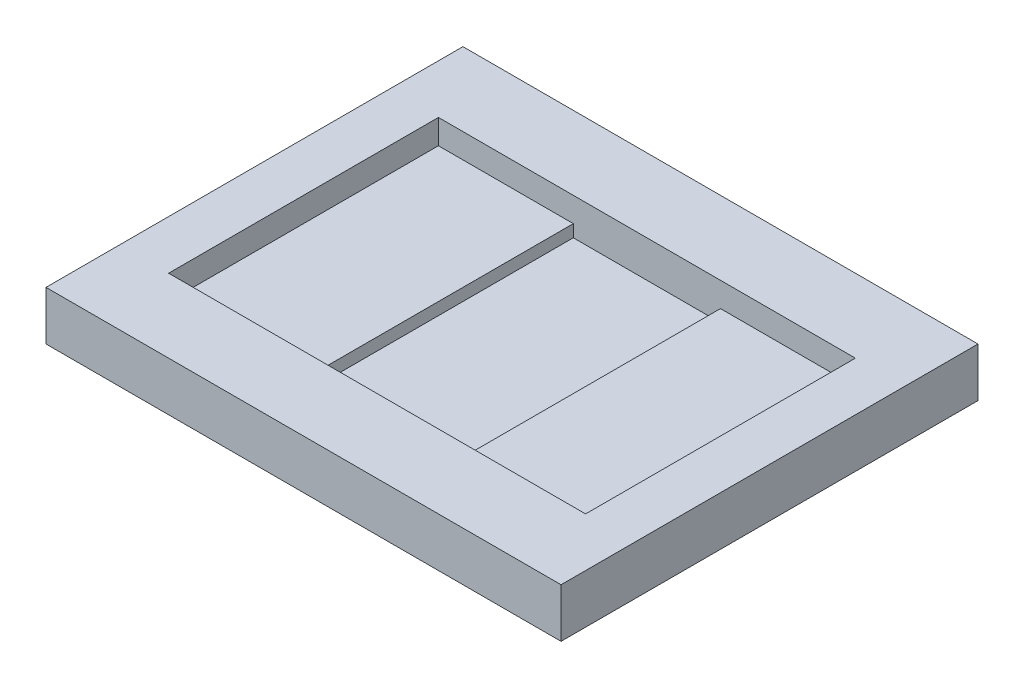
ISO-10303-21;
HEADER;
FILE_DESCRIPTION(('STEP AP214'),'2;1');
FILE_NAME('part.step','',(''),(''),'','','');
FILE_SCHEMA(('AUTOMOTIVE_DESIGN { 1 0 10303 214 1 1 1 1 }'));
ENDSEC;
DATA;
#1=APPLICATION_CONTEXT('core data for automotive mechanical design processes');
#2=APPLICATION_PROTOCOL_DEFINITION('international standard','automotive_design',2000,#1);
#3=PRODUCT_CONTEXT('',#1,'mechanical');
#4=PRODUCT('Part','Part','',(#3));
#5=PRODUCT_RELATED_PRODUCT_CATEGORY('part','',(#4));
#6=PRODUCT_DEFINITION_FORMATION('','',#4);
#7=PRODUCT_DEFINITION_CONTEXT('part definition',#1,'design');
#8=PRODUCT_DEFINITION('design','',#6,#7);
#9=PRODUCT_DEFINITION_SHAPE('','',#8);
#10=(LENGTH_UNIT() NAMED_UNIT(*) SI_UNIT(.MILLI.,.METRE.));
#11=(NAMED_UNIT(*) PLANE_ANGLE_UNIT() SI_UNIT($,.RADIAN.));
#12=(NAMED_UNIT(*) SI_UNIT($,.STERADIAN.) SOLID_ANGLE_UNIT());
#13=UNCERTAINTY_MEASURE_WITH_UNIT(LENGTH_MEASURE(1.E-05),#10,'distance_accuracy_value','');
#14=(GEOMETRIC_REPRESENTATION_CONTEXT(3) GLOBAL_UNCERTAINTY_ASSIGNED_CONTEXT((#13)) GLOBAL_UNIT_ASSIGNED_CONTEXT((#10,
#11,#12)) REPRESENTATION_CONTEXT('',''));
#15=CARTESIAN_POINT('',(0.,0.,0.));
#16=DIRECTION('',(0.,0.,1.));
#17=DIRECTION('',(1.,0.,0.));
#18=AXIS2_PLACEMENT_3D('',#15,#16,#17);
#19=CARTESIAN_POINT('',(0.,6.34999999999997,0.));
#20=DIRECTION('',(0.,1.,0.));
#21=DIRECTION('',(1.,0.,0.));
#22=AXIS2_PLACEMENT_3D('',#19,#20,#21);
#23=PLANE('',#22);
#24=DIRECTION('',(0.,0.,-1.));
#25=VECTOR('',#24,1.);
#26=CARTESIAN_POINT('',(38.1,6.34999999999997,-82.5499999999999));
#27=LINE('',#26,#25);
#28=CARTESIAN_POINT('',(38.1,6.34999999999997,69.85));
#29=VERTEX_POINT('',#28);
#30=CARTESIAN_POINT('',(38.1,6.34999999999997,-69.85));
#31=VERTEX_POINT('',#30);
#32=EDGE_CURVE('E71',#29,#31,#27,.T.);
#33=ORIENTED_EDGE('',*,*,#32,.T.);
#34=DIRECTION('',(-1.,0.,0.));
#35=VECTOR('',#34,1.);
#36=CARTESIAN_POINT('',(0.,6.34999999999997,-69.85));
#37=LINE('',#36,#35);
#38=CARTESIAN_POINT('',(-38.1,6.34999999999997,-69.85));
#39=VERTEX_POINT('',#38);
#40=EDGE_CURVE('E384',#31,#39,#37,.T.);
#41=ORIENTED_EDGE('',*,*,#40,.T.);
#42=DIRECTION('',(0.,0.,1.));
#43=VECTOR('',#42,1.);
#44=CARTESIAN_POINT('',(-38.1,6.34999999999997,-82.5499999999999));
#45=LINE('',#44,#43);
#46=CARTESIAN_POINT('',(-38.1,6.34999999999997,69.85));
#47=VERTEX_POINT('',#46);
#48=EDGE_CURVE('E13',#39,#47,#45,.T.);
#49=ORIENTED_EDGE('',*,*,#48,.T.);
#50=DIRECTION('',(1.,0.,0.));
#51=VECTOR('',#50,1.);
#52=CARTESIAN_POINT('',(0.,6.34999999999997,69.85));
#53=LINE('',#52,#51);
#54=EDGE_CURVE('E371',#47,#29,#53,.T.);
#55=ORIENTED_EDGE('',*,*,#54,.T.);
#56=EDGE_LOOP('',(#33,#41,#49,#55));
#57=FACE_BOUND('',#56,.T.);
#58=ADVANCED_FACE('F61',(#57),#23,.T.);
#59=CARTESIAN_POINT('',(-38.1,6.34999999999997,-82.5499999999999));
#60=DIRECTION('',(-1.,0.,0.));
#61=DIRECTION('',(0.,1.,0.));
#62=AXIS2_PLACEMENT_3D('',#59,#60,#61);
#63=PLANE('',#62);
#64=DIRECTION('',(0.,0.,1.));
#65=VECTOR('',#64,1.);
#66=CARTESIAN_POINT('',(-38.1,12.7,-82.5499999999999));
#67=LINE('',#66,#65);
#68=CARTESIAN_POINT('',(-38.1,12.7,-69.85));
#69=VERTEX_POINT('',#68);
#70=CARTESIAN_POINT('',(-38.1,12.7,69.85));
#71=VERTEX_POINT('',#70);
#72=EDGE_CURVE('E379',#69,#71,#67,.T.);
#73=ORIENTED_EDGE('',*,*,#72,.T.);
#74=DIRECTION('',(0.,1.,0.));
#75=VECTOR('',#74,1.);
#76=CARTESIAN_POINT('',(-38.1,6.34999999999997,69.85));
#77=LINE('',#76,#75);
#78=EDGE_CURVE('E366',#47,#71,#77,.T.);
#79=ORIENTED_EDGE('',*,*,#78,.F.);
#80=ORIENTED_EDGE('',*,*,#48,.F.);
#81=DIRECTION('',(0.,1.,0.));
#82=VECTOR('',#81,1.);
#83=CARTESIAN_POINT('',(-38.1,12.7,-69.85));
#84=LINE('',#83,#82);
#85=EDGE_CURVE('E348',#39,#69,#84,.T.);
#86=ORIENTED_EDGE('',*,*,#85,.T.);
#87=EDGE_LOOP('',(#73,#79,#80,#86));
#88=FACE_BOUND('',#87,.T.);
#89=ADVANCED_FACE('F578',(#88),#63,.F.);
#90=CARTESIAN_POINT('',(38.1,6.34999999999997,-82.5499999999999));
#91=DIRECTION('',(1.,0.,0.));
#92=DIRECTION('',(0.,0.,1.));
#93=AXIS2_PLACEMENT_3D('',#90,#91,#92);
#94=PLANE('',#93);
#95=DIRECTION('',(0.,0.,-1.));
#96=VECTOR('',#95,1.);
#97=CARTESIAN_POINT('',(38.1,12.7,-82.5499999999999));
#98=LINE('',#97,#96);
#99=CARTESIAN_POINT('',(38.1,12.7,69.85));
#100=VERTEX_POINT('',#99);
#101=CARTESIAN_POINT('',(38.1,12.7,-69.85));
#102=VERTEX_POINT('',#101);
#103=EDGE_CURVE('E281',#100,#102,#98,.T.);
#104=ORIENTED_EDGE('',*,*,#103,.T.);
#105=DIRECTION('',(0.,1.,0.));
#106=VECTOR('',#105,1.);
#107=CARTESIAN_POINT('',(38.1,6.34999999999997,-69.85));
#108=LINE('',#107,#106);
#109=EDGE_CURVE('E315',#31,#102,#108,.T.);
#110=ORIENTED_EDGE('',*,*,#109,.F.);
#111=ORIENTED_EDGE('',*,*,#32,.F.);
#112=DIRECTION('',(0.,1.,0.));
#113=VECTOR('',#112,1.);
#114=CARTESIAN_POINT('',(38.1,12.7,69.85));
#115=LINE('',#114,#113);
#116=EDGE_CURVE('E390',#29,#100,#115,.T.);
#117=ORIENTED_EDGE('',*,*,#116,.T.);
#118=EDGE_LOOP('',(#104,#110,#111,#117));
#119=FACE_BOUND('',#118,.T.);
#120=ADVANCED_FACE('F583',(#119),#94,.F.);
#121=CARTESIAN_POINT('',(0.,12.7,0.));
#122=DIRECTION('',(0.,1.,0.));
#123=DIRECTION('',(1.,0.,0.));
#124=AXIS2_PLACEMENT_3D('',#121,#122,#123);
#125=PLANE('',#124);
#126=ORIENTED_EDGE('',*,*,#72,.F.);
#127=DIRECTION('',(-1.,0.,0.));
#128=VECTOR('',#127,1.);
#129=CARTESIAN_POINT('',(0.,12.7,-69.85));
#130=LINE('',#129,#128);
#131=CARTESIAN_POINT('',(-107.95,12.7,-69.85));
#132=VERTEX_POINT('',#131);
#133=EDGE_CURVE('E319',#69,#132,#130,.T.);
#134=ORIENTED_EDGE('',*,*,#133,.T.);
#135=DIRECTION('',(0.,0.,1.));
#136=VECTOR('',#135,1.);
#137=CARTESIAN_POINT('',(-107.95,12.7,-82.5499999999999));
#138=LINE('',#137,#136);
#139=CARTESIAN_POINT('',(-107.95,12.7,69.85));
#140=VERTEX_POINT('',#139);
#141=EDGE_CURVE('E85',#132,#140,#138,.T.);
#142=ORIENTED_EDGE('',*,*,#141,.T.);
#143=DIRECTION('',(1.,0.,0.));
#144=VECTOR('',#143,1.);
#145=CARTESIAN_POINT('',(0.,12.7,69.85));
#146=LINE('',#145,#144);
#147=EDGE_CURVE('E370',#140,#71,#146,.T.);
#148=ORIENTED_EDGE('',*,*,#147,.T.);
#149=EDGE_LOOP('',(#126,#134,#142,#148));
#150=FACE_BOUND('',#149,.T.);
#151=ADVANCED_FACE('F587',(#150),#125,.T.);
#152=CARTESIAN_POINT('',(-107.95,12.7,-82.5499999999999));
#153=DIRECTION('',(-1.,0.,0.));
#154=DIRECTION('',(0.,1.,0.));
#155=AXIS2_PLACEMENT_3D('',#152,#153,#154);
#156=PLANE('',#155);
#157=DIRECTION('',(0.,0.,1.));
#158=VECTOR('',#157,1.);
#159=CARTESIAN_POINT('',(-107.95,25.4,-82.5499999999999));
#160=LINE('',#159,#158);
#161=CARTESIAN_POINT('',(-107.95,25.4,-69.85));
#162=VERTEX_POINT('',#161);
#163=CARTESIAN_POINT('',(-107.95,25.4,69.85));
#164=VERTEX_POINT('',#163);
#165=EDGE_CURVE('E357',#162,#164,#160,.T.);
#166=ORIENTED_EDGE('',*,*,#165,.T.);
#167=DIRECTION('',(0.,1.,0.));
#168=VECTOR('',#167,1.);
#169=CARTESIAN_POINT('',(-107.95,12.7,69.85));
#170=LINE('',#169,#168);
#171=EDGE_CURVE('E380',#140,#164,#170,.T.);
#172=ORIENTED_EDGE('',*,*,#171,.F.);
#173=ORIENTED_EDGE('',*,*,#141,.F.);
#174=DIRECTION('',(0.,1.,0.));
#175=VECTOR('',#174,1.);
#176=CARTESIAN_POINT('',(-107.95,12.7,-69.85));
#177=LINE('',#176,#175);
#178=EDGE_CURVE('E316',#132,#162,#177,.T.);
#179=ORIENTED_EDGE('',*,*,#178,.T.);
#180=EDGE_LOOP('',(#166,#172,#173,#179));
#181=FACE_BOUND('',#180,.T.);
#182=ADVANCED_FACE('F592',(#181),#156,.F.);
#183=CARTESIAN_POINT('',(-107.95,12.7,69.85));
#184=DIRECTION('',(0.,0.,1.));
#185=DIRECTION('',(1.,0.,0.));
#186=AXIS2_PLACEMENT_3D('',#183,#184,#185);
#187=PLANE('',#186);
#188=DIRECTION('',(1.,0.,0.));
#189=VECTOR('',#188,1.);
#190=CARTESIAN_POINT('',(0.,25.4,69.85));
#191=LINE('',#190,#189);
#192=CARTESIAN_POINT('',(107.95,25.4,69.85));
#193=VERTEX_POINT('',#192);
#194=EDGE_CURVE('E360',#164,#193,#191,.T.);
#195=ORIENTED_EDGE('',*,*,#194,.T.);
#196=DIRECTION('',(0.,1.,0.));
#197=VECTOR('',#196,1.);
#198=CARTESIAN_POINT('',(107.95,12.7,69.85));
#199=LINE('',#198,#197);
#200=CARTESIAN_POINT('',(107.95,12.7,69.85));
#201=VERTEX_POINT('',#200);
#202=EDGE_CURVE('E185',#201,#193,#199,.T.);
#203=ORIENTED_EDGE('',*,*,#202,.F.);
#204=DIRECTION('',(1.,0.,0.));
#205=VECTOR('',#204,1.);
#206=CARTESIAN_POINT('',(0.,12.7,69.85));
#207=LINE('',#206,#205);
#208=EDGE_CURVE('E304',#100,#201,#207,.T.);
#209=ORIENTED_EDGE('',*,*,#208,.F.);
#210=ORIENTED_EDGE('',*,*,#116,.F.);
#211=ORIENTED_EDGE('',*,*,#54,.F.);
#212=ORIENTED_EDGE('',*,*,#78,.T.);
#213=ORIENTED_EDGE('',*,*,#147,.F.);
#214=ORIENTED_EDGE('',*,*,#171,.T.);
#215=EDGE_LOOP('',(#195,#203,#209,#210,#211,#212,#213,#214));
#216=FACE_BOUND('',#215,.T.);
#217=ADVANCED_FACE('F596',(#216),#187,.F.);
#218=CARTESIAN_POINT('',(107.95,12.7,82.5499999999999));
#219=DIRECTION('',(1.,0.,0.));
#220=DIRECTION('',(0.,1.,0.));
#221=AXIS2_PLACEMENT_3D('',#218,#219,#220);
#222=PLANE('',#221);
#223=DIRECTION('',(0.,0.,-1.));
#224=VECTOR('',#223,1.);
#225=CARTESIAN_POINT('',(107.95,25.4,82.5499999999999));
#226=LINE('',#225,#224);
#227=CARTESIAN_POINT('',(107.95,25.4,-69.85));
#228=VERTEX_POINT('',#227);
#229=EDGE_CURVE('E352',#193,#228,#226,.T.);
#230=ORIENTED_EDGE('',*,*,#229,.T.);
#231=DIRECTION('',(0.,1.,0.));
#232=VECTOR('',#231,1.);
#233=CARTESIAN_POINT('',(107.95,12.7,-69.85));
#234=LINE('',#233,#232);
#235=CARTESIAN_POINT('',(107.95,12.7,-69.85));
#236=VERTEX_POINT('',#235);
#237=EDGE_CURVE('E175',#236,#228,#234,.T.);
#238=ORIENTED_EDGE('',*,*,#237,.F.);
#239=DIRECTION('',(0.,0.,-1.));
#240=VECTOR('',#239,1.);
#241=CARTESIAN_POINT('',(107.95,12.7,82.5499999999999));
#242=LINE('',#241,#240);
#243=EDGE_CURVE('E308',#201,#236,#242,.T.);
#244=ORIENTED_EDGE('',*,*,#243,.F.);
#245=ORIENTED_EDGE('',*,*,#202,.T.);
#246=EDGE_LOOP('',(#230,#238,#244,#245));
#247=FACE_BOUND('',#246,.T.);
#248=ADVANCED_FACE('F605',(#247),#222,.F.);
#249=CARTESIAN_POINT('',(107.95,12.7,-69.85));
#250=DIRECTION('',(0.,0.,-1.));
#251=DIRECTION('',(-1.,0.,0.));
#252=AXIS2_PLACEMENT_3D('',#249,#250,#251);
#253=PLANE('',#252);
#254=DIRECTION('',(-1.,0.,0.));
#255=VECTOR('',#254,1.);
#256=CARTESIAN_POINT('',(0.,25.4,-69.85));
#257=LINE('',#256,#255);
#258=EDGE_CURVE('E300',#228,#162,#257,.T.);
#259=ORIENTED_EDGE('',*,*,#258,.T.);
#260=ORIENTED_EDGE('',*,*,#178,.F.);
#261=ORIENTED_EDGE('',*,*,#133,.F.);
#262=ORIENTED_EDGE('',*,*,#85,.F.);
#263=ORIENTED_EDGE('',*,*,#40,.F.);
#264=ORIENTED_EDGE('',*,*,#109,.T.);
#265=DIRECTION('',(-1.,0.,0.));
#266=VECTOR('',#265,1.);
#267=CARTESIAN_POINT('',(0.,12.7,-69.85));
#268=LINE('',#267,#266);
#269=EDGE_CURVE('E312',#236,#102,#268,.T.);
#270=ORIENTED_EDGE('',*,*,#269,.F.);
#271=ORIENTED_EDGE('',*,*,#237,.T.);
#272=EDGE_LOOP('',(#259,#260,#261,#262,#263,#264,#270,#271));
#273=FACE_BOUND('',#272,.T.);
#274=ADVANCED_FACE('F613',(#273),#253,.F.);
#275=CARTESIAN_POINT('',(95.2500000000001,-25.4,57.15));
#276=DIRECTION('',(0.,1.,0.));
#277=DIRECTION('',(1.,0.,0.));
#278=AXIS2_PLACEMENT_3D('',#275,#276,#277);
#279=PLANE('',#278);
#280=CARTESIAN_POINT('',(95.2500000000001,-25.4,57.15));
#281=DIRECTION('',(0.,1.,0.));
#282=DIRECTION('',(0.,0.,1.));
#283=AXIS2_PLACEMENT_3D('',#280,#281,#282);
#284=CIRCLE('',#283,9.525);
#285=CARTESIAN_POINT('',(95.2500000000001,-25.4,66.675));
#286=VERTEX_POINT('',#285);
#287=CARTESIAN_POINT('',(95.2500000000001,-25.4,47.625));
#288=VERTEX_POINT('',#287);
#289=EDGE_CURVE('E1075',#286,#288,#284,.T.);
#290=ORIENTED_EDGE('',*,*,#289,.F.);
#291=CARTESIAN_POINT('',(95.2500000000001,-25.4,57.15));
#292=DIRECTION('',(0.,1.,0.));
#293=DIRECTION('',(0.,0.,1.));
#294=AXIS2_PLACEMENT_3D('',#291,#292,#293);
#295=CIRCLE('',#294,9.525);
#296=EDGE_CURVE('E320',#288,#286,#295,.T.);
#297=ORIENTED_EDGE('',*,*,#296,.F.);
#298=EDGE_LOOP('',(#290,#297));
#299=FACE_BOUND('',#298,.T.);
#300=ADVANCED_FACE('F623',(#299),#279,.F.);
#301=CARTESIAN_POINT('',(95.2500000000001,-25.4,57.15));
#302=DIRECTION('',(0.,1.,0.));
#303=DIRECTION('',(0.,0.,1.));
#304=AXIS2_PLACEMENT_3D('',#301,#302,#303);
#305=CYLINDRICAL_SURFACE('',#304,9.525);
#306=DIRECTION('',(0.,1.,0.));
#307=VECTOR('',#306,1.);
#308=CARTESIAN_POINT('',(95.2500000000001,-25.4,47.625));
#309=LINE('',#308,#307);
#310=CARTESIAN_POINT('',(95.2500000000001,0.,47.625));
#311=VERTEX_POINT('',#310);
#312=EDGE_CURVE('E1060',#288,#311,#309,.T.);
#313=ORIENTED_EDGE('',*,*,#312,.F.);
#314=ORIENTED_EDGE('',*,*,#296,.T.);
#315=DIRECTION('',(0.,1.,0.));
#316=VECTOR('',#315,1.);
#317=CARTESIAN_POINT('',(95.2500000000001,-25.4,66.675));
#318=LINE('',#317,#316);
#319=CARTESIAN_POINT('',(95.2500000000001,0.,66.675));
#320=VERTEX_POINT('',#319);
#321=EDGE_CURVE('E1019',#286,#320,#318,.T.);
#322=ORIENTED_EDGE('',*,*,#321,.T.);
#323=CARTESIAN_POINT('',(95.2500000000001,0.,57.15));
#324=DIRECTION('',(0.,1.,0.));
#325=DIRECTION('',(0.,0.,1.));
#326=AXIS2_PLACEMENT_3D('',#323,#324,#325);
#327=CIRCLE('',#326,9.525);
#328=EDGE_CURVE('E353',#311,#320,#327,.T.);
#329=ORIENTED_EDGE('',*,*,#328,.F.);
#330=EDGE_LOOP('',(#313,#314,#322,#329));
#331=FACE_BOUND('',#330,.T.);
#332=ADVANCED_FACE('F618',(#331),#305,.T.);
#333=CARTESIAN_POINT('',(95.2500000000001,-25.4,-57.15));
#334=DIRECTION('',(0.,1.,0.));
#335=DIRECTION('',(1.,0.,0.));
#336=AXIS2_PLACEMENT_3D('',#333,#334,#335);
#337=PLANE('',#336);
#338=CARTESIAN_POINT('',(95.2500000000001,-25.4,-57.15));
#339=DIRECTION('',(0.,1.,0.));
#340=DIRECTION('',(0.,0.,1.));
#341=AXIS2_PLACEMENT_3D('',#338,#339,#340);
#342=CIRCLE('',#341,9.525);
#343=CARTESIAN_POINT('',(95.2500000000001,-25.4,-47.625));
#344=VERTEX_POINT('',#343);
#345=CARTESIAN_POINT('',(95.2500000000001,-25.4,-66.675));
#346=VERTEX_POINT('',#345);
#347=EDGE_CURVE('E1011',#344,#346,#342,.T.);
#348=ORIENTED_EDGE('',*,*,#347,.F.);
#349=CARTESIAN_POINT('',(95.2500000000001,-25.4,-57.15));
#350=DIRECTION('',(0.,1.,0.));
#351=DIRECTION('',(0.,0.,1.));
#352=AXIS2_PLACEMENT_3D('',#349,#350,#351);
#353=CIRCLE('',#352,9.525);
#354=EDGE_CURVE('E343',#346,#344,#353,.T.);
#355=ORIENTED_EDGE('',*,*,#354,.F.);
#356=EDGE_LOOP('',(#348,#355));
#357=FACE_BOUND('',#356,.T.);
#358=ADVANCED_FACE('F622',(#357),#337,.F.);
#359=CARTESIAN_POINT('',(95.2500000000001,-25.4,-57.15));
#360=DIRECTION('',(0.,1.,0.));
#361=DIRECTION('',(0.,0.,1.));
#362=AXIS2_PLACEMENT_3D('',#359,#360,#361);
#363=CYLINDRICAL_SURFACE('',#362,9.525);
#364=DIRECTION('',(0.,1.,0.));
#365=VECTOR('',#364,1.);
#366=CARTESIAN_POINT('',(95.2500000000001,-25.4,-66.675));
#367=LINE('',#366,#365);
#368=CARTESIAN_POINT('',(95.2500000000001,0.,-66.675));
#369=VERTEX_POINT('',#368);
#370=EDGE_CURVE('E1006',#346,#369,#367,.T.);
#371=ORIENTED_EDGE('',*,*,#370,.F.);
#372=ORIENTED_EDGE('',*,*,#354,.T.);
#373=DIRECTION('',(0.,1.,0.));
#374=VECTOR('',#373,1.);
#375=CARTESIAN_POINT('',(95.2500000000001,-25.4,-47.625));
#376=LINE('',#375,#374);
#377=CARTESIAN_POINT('',(95.2500000000001,0.,-47.625));
#378=VERTEX_POINT('',#377);
#379=EDGE_CURVE('E970',#344,#378,#376,.T.);
#380=ORIENTED_EDGE('',*,*,#379,.T.);
#381=CARTESIAN_POINT('',(95.2500000000001,0.,-57.15));
#382=DIRECTION('',(0.,1.,0.));
#383=DIRECTION('',(0.,0.,1.));
#384=AXIS2_PLACEMENT_3D('',#381,#382,#383);
#385=CIRCLE('',#384,9.525);
#386=EDGE_CURVE('E356',#369,#378,#385,.T.);
#387=ORIENTED_EDGE('',*,*,#386,.F.);
#388=EDGE_LOOP('',(#371,#372,#380,#387));
#389=FACE_BOUND('',#388,.T.);
#390=ADVANCED_FACE('F639',(#389),#363,.T.);
#391=CARTESIAN_POINT('',(-95.25,-25.4,-57.15));
#392=DIRECTION('',(0.,1.,0.));
#393=DIRECTION('',(1.,0.,0.));
#394=AXIS2_PLACEMENT_3D('',#391,#392,#393);
#395=PLANE('',#394);
#396=CARTESIAN_POINT('',(-95.25,-25.4,-57.15));
#397=DIRECTION('',(0.,1.,0.));
#398=DIRECTION('',(0.,0.,1.));
#399=AXIS2_PLACEMENT_3D('',#396,#397,#398);
#400=CIRCLE('',#399,9.525);
#401=CARTESIAN_POINT('',(-95.25,-25.4,-47.625));
#402=VERTEX_POINT('',#401);
#403=CARTESIAN_POINT('',(-95.25,-25.4,-66.675));
#404=VERTEX_POINT('',#403);
#405=EDGE_CURVE('E964',#402,#404,#400,.T.);
#406=ORIENTED_EDGE('',*,*,#405,.F.);
#407=CARTESIAN_POINT('',(-95.25,-25.4,-57.15));
#408=DIRECTION('',(0.,1.,0.));
#409=DIRECTION('',(0.,0.,1.));
#410=AXIS2_PLACEMENT_3D('',#407,#408,#409);
#411=CIRCLE('',#410,9.525);
#412=EDGE_CURVE('E340',#404,#402,#411,.T.);
#413=ORIENTED_EDGE('',*,*,#412,.F.);
#414=EDGE_LOOP('',(#406,#413));
#415=FACE_BOUND('',#414,.T.);
#416=ADVANCED_FACE('F645',(#415),#395,.F.);
#417=CARTESIAN_POINT('',(-95.25,-25.4,-57.15));
#418=DIRECTION('',(0.,1.,0.));
#419=DIRECTION('',(0.,0.,1.));
#420=AXIS2_PLACEMENT_3D('',#417,#418,#419);
#421=CYLINDRICAL_SURFACE('',#420,9.525);
#422=DIRECTION('',(0.,1.,0.));
#423=VECTOR('',#422,1.);
#424=CARTESIAN_POINT('',(-95.25,-25.4,-66.675));
#425=LINE('',#424,#423);
#426=CARTESIAN_POINT('',(-95.25,0.,-66.675));
#427=VERTEX_POINT('',#426);
#428=EDGE_CURVE('E969',#404,#427,#425,.T.);
#429=ORIENTED_EDGE('',*,*,#428,.F.);
#430=ORIENTED_EDGE('',*,*,#412,.T.);
#431=DIRECTION('',(0.,1.,0.));
#432=VECTOR('',#431,1.);
#433=CARTESIAN_POINT('',(-95.25,-25.4,-47.625));
#434=LINE('',#433,#432);
#435=CARTESIAN_POINT('',(-95.25,0.,-47.625));
#436=VERTEX_POINT('',#435);
#437=EDGE_CURVE('E989',#402,#436,#434,.T.);
#438=ORIENTED_EDGE('',*,*,#437,.T.);
#439=CARTESIAN_POINT('',(-95.25,0.,-57.15));
#440=DIRECTION('',(0.,1.,0.));
#441=DIRECTION('',(0.,0.,1.));
#442=AXIS2_PLACEMENT_3D('',#439,#440,#441);
#443=CIRCLE('',#442,9.525);
#444=EDGE_CURVE('E272',#427,#436,#443,.T.);
#445=ORIENTED_EDGE('',*,*,#444,.F.);
#446=EDGE_LOOP('',(#429,#430,#438,#445));
#447=FACE_BOUND('',#446,.T.);
#448=ADVANCED_FACE('F649',(#447),#421,.T.);
#449=CARTESIAN_POINT('',(-95.25,-25.4,57.15));
#450=DIRECTION('',(0.,1.,0.));
#451=DIRECTION('',(1.,0.,0.));
#452=AXIS2_PLACEMENT_3D('',#449,#450,#451);
#453=PLANE('',#452);
#454=CARTESIAN_POINT('',(-95.25,-25.4,57.15));
#455=DIRECTION('',(0.,1.,0.));
#456=DIRECTION('',(0.,0.,1.));
#457=AXIS2_PLACEMENT_3D('',#454,#455,#456);
#458=CIRCLE('',#457,9.525);
#459=CARTESIAN_POINT('',(-95.25,-25.4,66.675));
#460=VERTEX_POINT('',#459);
#461=CARTESIAN_POINT('',(-95.25,-25.4,47.625));
#462=VERTEX_POINT('',#461);
#463=EDGE_CURVE('E290',#460,#462,#458,.T.);
#464=ORIENTED_EDGE('',*,*,#463,.F.);
#465=CARTESIAN_POINT('',(-95.25,-25.4,57.15));
#466=DIRECTION('',(0.,1.,0.));
#467=DIRECTION('',(0.,0.,1.));
#468=AXIS2_PLACEMENT_3D('',#465,#466,#467);
#469=CIRCLE('',#468,9.525);
#470=EDGE_CURVE('E271',#462,#460,#469,.T.);
#471=ORIENTED_EDGE('',*,*,#470,.F.);
#472=EDGE_LOOP('',(#464,#471));
#473=FACE_BOUND('',#472,.T.);
#474=ADVANCED_FACE('F658',(#473),#453,.F.);
#475=CARTESIAN_POINT('',(-95.25,-25.4,57.15));
#476=DIRECTION('',(0.,1.,0.));
#477=DIRECTION('',(0.,0.,1.));
#478=AXIS2_PLACEMENT_3D('',#475,#476,#477);
#479=CYLINDRICAL_SURFACE('',#478,9.525);
#480=DIRECTION('',(0.,1.,0.));
#481=VECTOR('',#480,1.);
#482=CARTESIAN_POINT('',(-95.25,-25.4,47.625));
#483=LINE('',#482,#481);
#484=CARTESIAN_POINT('',(-95.25,0.,47.625));
#485=VERTEX_POINT('',#484);
#486=EDGE_CURVE('E284',#462,#485,#483,.T.);
#487=ORIENTED_EDGE('',*,*,#486,.F.);
#488=ORIENTED_EDGE('',*,*,#470,.T.);
#489=DIRECTION('',(0.,1.,0.));
#490=VECTOR('',#489,1.);
#491=CARTESIAN_POINT('',(-95.25,-25.4,66.675));
#492=LINE('',#491,#490);
#493=CARTESIAN_POINT('',(-95.25,0.,66.675));
#494=VERTEX_POINT('',#493);
#495=EDGE_CURVE('E275',#460,#494,#492,.T.);
#496=ORIENTED_EDGE('',*,*,#495,.T.);
#497=CARTESIAN_POINT('',(-95.25,0.,57.15));
#498=DIRECTION('',(0.,1.,0.));
#499=DIRECTION('',(0.,0.,1.));
#500=AXIS2_PLACEMENT_3D('',#497,#498,#499);
#501=CIRCLE('',#500,9.525);
#502=EDGE_CURVE('E261',#485,#494,#501,.T.);
#503=ORIENTED_EDGE('',*,*,#502,.F.);
#504=EDGE_LOOP('',(#487,#488,#496,#503));
#505=FACE_BOUND('',#504,.T.);
#506=ADVANCED_FACE('F276',(#505),#479,.T.);
#507=CARTESIAN_POINT('',(0.,0.,0.));
#508=DIRECTION('',(0.,1.,0.));
#509=DIRECTION('',(1.,0.,0.));
#510=AXIS2_PLACEMENT_3D('',#507,#508,#509);
#511=PLANE('',#510);
#512=CARTESIAN_POINT('',(-95.25,0.,57.15));
#513=DIRECTION('',(0.,1.,0.));
#514=DIRECTION('',(0.,0.,1.));
#515=AXIS2_PLACEMENT_3D('',#512,#513,#514);
#516=CIRCLE('',#515,9.525);
#517=EDGE_CURVE('E266',#494,#485,#516,.T.);
#518=ORIENTED_EDGE('',*,*,#517,.T.);
#519=ORIENTED_EDGE('',*,*,#502,.T.);
#520=EDGE_LOOP('',(#518,#519));
#521=FACE_BOUND('',#520,.T.);
#522=CARTESIAN_POINT('',(-95.25,0.,-57.15));
#523=DIRECTION('',(0.,1.,0.));
#524=DIRECTION('',(0.,0.,1.));
#525=AXIS2_PLACEMENT_3D('',#522,#523,#524);
#526=CIRCLE('',#525,9.525);
#527=EDGE_CURVE('E994',#436,#427,#526,.T.);
#528=ORIENTED_EDGE('',*,*,#527,.T.);
#529=ORIENTED_EDGE('',*,*,#444,.T.);
#530=EDGE_LOOP('',(#528,#529));
#531=FACE_BOUND('',#530,.T.);
#532=CARTESIAN_POINT('',(95.2500000000001,0.,-57.15));
#533=DIRECTION('',(0.,1.,0.));
#534=DIRECTION('',(0.,0.,1.));
#535=AXIS2_PLACEMENT_3D('',#532,#533,#534);
#536=CIRCLE('',#535,9.525);
#537=EDGE_CURVE('E1002',#378,#369,#536,.T.);
#538=ORIENTED_EDGE('',*,*,#537,.T.);
#539=ORIENTED_EDGE('',*,*,#386,.T.);
#540=EDGE_LOOP('',(#538,#539));
#541=FACE_BOUND('',#540,.T.);
#542=CARTESIAN_POINT('',(95.2500000000001,0.,57.15));
#543=DIRECTION('',(0.,1.,0.));
#544=DIRECTION('',(0.,0.,1.));
#545=AXIS2_PLACEMENT_3D('',#542,#543,#544);
#546=CIRCLE('',#545,9.525);
#547=EDGE_CURVE('E1040',#320,#311,#546,.T.);
#548=ORIENTED_EDGE('',*,*,#547,.T.);
#549=ORIENTED_EDGE('',*,*,#328,.T.);
#550=EDGE_LOOP('',(#548,#549));
#551=FACE_BOUND('',#550,.T.);
#552=DIRECTION('',(0.,0.,-1.));
#553=VECTOR('',#552,1.);
#554=CARTESIAN_POINT('',(133.35,0.,0.));
#555=LINE('',#554,#553);
#556=CARTESIAN_POINT('',(133.35,0.,107.95));
#557=VERTEX_POINT('',#556);
#558=CARTESIAN_POINT('',(133.35,0.,-107.95));
#559=VERTEX_POINT('',#558);
#560=EDGE_CURVE('E335',#557,#559,#555,.T.);
#561=ORIENTED_EDGE('',*,*,#560,.F.);
#562=DIRECTION('',(-1.,0.,0.));
#563=VECTOR('',#562,1.);
#564=CARTESIAN_POINT('',(0.,0.,107.95));
#565=LINE('',#564,#563);
#566=CARTESIAN_POINT('',(-133.35,0.,107.95));
#567=VERTEX_POINT('',#566);
#568=EDGE_CURVE('E328',#557,#567,#565,.T.);
#569=ORIENTED_EDGE('',*,*,#568,.T.);
#570=DIRECTION('',(0.,0.,-1.));
#571=VECTOR('',#570,1.);
#572=CARTESIAN_POINT('',(-133.35,0.,0.));
#573=LINE('',#572,#571);
#574=CARTESIAN_POINT('',(-133.35,0.,-107.95));
#575=VERTEX_POINT('',#574);
#576=EDGE_CURVE('E324',#567,#575,#573,.T.);
#577=ORIENTED_EDGE('',*,*,#576,.T.);
#578=DIRECTION('',(-1.,0.,0.));
#579=VECTOR('',#578,1.);
#580=CARTESIAN_POINT('',(0.,0.,-107.95));
#581=LINE('',#580,#579);
#582=EDGE_CURVE('E296',#559,#575,#581,.T.);
#583=ORIENTED_EDGE('',*,*,#582,.F.);
#584=EDGE_LOOP('',(#561,#569,#577,#583));
#585=FACE_BOUND('',#584,.T.);
#586=ADVANCED_FACE('F263',(#521,#531,#541,#551,#585),#511,.F.);
#587=CARTESIAN_POINT('',(0.,25.4,0.));
#588=DIRECTION('',(0.,1.,0.));
#589=DIRECTION('',(1.,0.,0.));
#590=AXIS2_PLACEMENT_3D('',#587,#588,#589);
#591=PLANE('',#590);
#592=ORIENTED_EDGE('',*,*,#258,.F.);
#593=ORIENTED_EDGE('',*,*,#229,.F.);
#594=ORIENTED_EDGE('',*,*,#194,.F.);
#595=ORIENTED_EDGE('',*,*,#165,.F.);
#596=EDGE_LOOP('',(#592,#593,#594,#595));
#597=FACE_BOUND('',#596,.T.);
#598=DIRECTION('',(-1.,0.,0.));
#599=VECTOR('',#598,1.);
#600=CARTESIAN_POINT('',(0.,25.4,107.95));
#601=LINE('',#600,#599);
#602=CARTESIAN_POINT('',(133.35,25.4,107.95));
#603=VERTEX_POINT('',#602);
#604=CARTESIAN_POINT('',(-133.35,25.4,107.95));
#605=VERTEX_POINT('',#604);
#606=EDGE_CURVE('E330',#603,#605,#601,.T.);
#607=ORIENTED_EDGE('',*,*,#606,.F.);
#608=DIRECTION('',(0.,0.,-1.));
#609=VECTOR('',#608,1.);
#610=CARTESIAN_POINT('',(133.35,25.4,0.));
#611=LINE('',#610,#609);
#612=CARTESIAN_POINT('',(133.35,25.4,-107.95));
#613=VERTEX_POINT('',#612);
#614=EDGE_CURVE('E406',#603,#613,#611,.T.);
#615=ORIENTED_EDGE('',*,*,#614,.T.);
#616=DIRECTION('',(-1.,0.,0.));
#617=VECTOR('',#616,1.);
#618=CARTESIAN_POINT('',(0.,25.4,-107.95));
#619=LINE('',#618,#617);
#620=CARTESIAN_POINT('',(-133.35,25.4,-107.95));
#621=VERTEX_POINT('',#620);
#622=EDGE_CURVE('E164',#613,#621,#619,.T.);
#623=ORIENTED_EDGE('',*,*,#622,.T.);
#624=DIRECTION('',(0.,0.,-1.));
#625=VECTOR('',#624,1.);
#626=CARTESIAN_POINT('',(-133.35,25.4,0.));
#627=LINE('',#626,#625);
#628=EDGE_CURVE('E294',#605,#621,#627,.T.);
#629=ORIENTED_EDGE('',*,*,#628,.F.);
#630=EDGE_LOOP('',(#607,#615,#623,#629));
#631=FACE_BOUND('',#630,.T.);
#632=ADVANCED_FACE('F421',(#597,#631),#591,.T.);
#633=CARTESIAN_POINT('',(0.,25.4,-107.95));
#634=DIRECTION('',(0.,0.,1.));
#635=DIRECTION('',(1.,0.,0.));
#636=AXIS2_PLACEMENT_3D('',#633,#634,#635);
#637=PLANE('',#636);
#638=ORIENTED_EDGE('',*,*,#622,.F.);
#639=DIRECTION('',(0.,-1.,0.));
#640=VECTOR('',#639,1.);
#641=CARTESIAN_POINT('',(133.35,25.4,-107.95));
#642=LINE('',#641,#640);
#643=EDGE_CURVE('E64',#613,#559,#642,.T.);
#644=ORIENTED_EDGE('',*,*,#643,.T.);
#645=ORIENTED_EDGE('',*,*,#582,.T.);
#646=DIRECTION('',(0.,-1.,0.));
#647=VECTOR('',#646,1.);
#648=CARTESIAN_POINT('',(-133.35,25.4,-107.95));
#649=LINE('',#648,#647);
#650=EDGE_CURVE('E329',#621,#575,#649,.T.);
#651=ORIENTED_EDGE('',*,*,#650,.F.);
#652=EDGE_LOOP('',(#638,#644,#645,#651));
#653=FACE_BOUND('',#652,.T.);
#654=ADVANCED_FACE('F667',(#653),#637,.F.);
#655=CARTESIAN_POINT('',(133.35,25.4,0.));
#656=DIRECTION('',(-1.,0.,0.));
#657=DIRECTION('',(0.,1.,0.));
#658=AXIS2_PLACEMENT_3D('',#655,#656,#657);
#659=PLANE('',#658);
#660=ORIENTED_EDGE('',*,*,#614,.F.);
#661=DIRECTION('',(0.,-1.,0.));
#662=VECTOR('',#661,1.);
#663=CARTESIAN_POINT('',(133.35,25.4,107.95));
#664=LINE('',#663,#662);
#665=EDGE_CURVE('E339',#603,#557,#664,.T.);
#666=ORIENTED_EDGE('',*,*,#665,.T.);
#667=ORIENTED_EDGE('',*,*,#560,.T.);
#668=ORIENTED_EDGE('',*,*,#643,.F.);
#669=EDGE_LOOP('',(#660,#666,#667,#668));
#670=FACE_BOUND('',#669,.T.);
#671=ADVANCED_FACE('F676',(#670),#659,.F.);
#672=CARTESIAN_POINT('',(0.,25.4,107.95));
#673=DIRECTION('',(0.,0.,1.));
#674=DIRECTION('',(1.,0.,0.));
#675=AXIS2_PLACEMENT_3D('',#672,#673,#674);
#676=PLANE('',#675);
#677=ORIENTED_EDGE('',*,*,#568,.F.);
#678=ORIENTED_EDGE('',*,*,#665,.F.);
#679=ORIENTED_EDGE('',*,*,#606,.T.);
#680=DIRECTION('',(0.,-1.,0.));
#681=VECTOR('',#680,1.);
#682=CARTESIAN_POINT('',(-133.35,25.4,107.95));
#683=LINE('',#682,#681);
#684=EDGE_CURVE('E334',#605,#567,#683,.T.);
#685=ORIENTED_EDGE('',*,*,#684,.T.);
#686=EDGE_LOOP('',(#677,#678,#679,#685));
#687=FACE_BOUND('',#686,.T.);
#688=ADVANCED_FACE('F685',(#687),#676,.T.);
#689=CARTESIAN_POINT('',(-133.35,25.4,0.));
#690=DIRECTION('',(-1.,0.,0.));
#691=DIRECTION('',(0.,1.,0.));
#692=AXIS2_PLACEMENT_3D('',#689,#690,#691);
#693=PLANE('',#692);
#694=ORIENTED_EDGE('',*,*,#628,.T.);
#695=ORIENTED_EDGE('',*,*,#650,.T.);
#696=ORIENTED_EDGE('',*,*,#576,.F.);
#697=ORIENTED_EDGE('',*,*,#684,.F.);
#698=EDGE_LOOP('',(#694,#695,#696,#697));
#699=FACE_BOUND('',#698,.T.);
#700=ADVANCED_FACE('F419',(#699),#693,.T.);
#701=CARTESIAN_POINT('',(0.,12.7,0.));
#702=DIRECTION('',(0.,1.,0.));
#703=DIRECTION('',(1.,0.,0.));
#704=AXIS2_PLACEMENT_3D('',#701,#702,#703);
#705=PLANE('',#704);
#706=ORIENTED_EDGE('',*,*,#103,.F.);
#707=ORIENTED_EDGE('',*,*,#208,.T.);
#708=ORIENTED_EDGE('',*,*,#243,.T.);
#709=ORIENTED_EDGE('',*,*,#269,.T.);
#710=EDGE_LOOP('',(#706,#707,#708,#709));
#711=FACE_BOUND('',#710,.T.);
#712=ADVANCED_FACE('F717',(#711),#705,.T.);
#713=CARTESIAN_POINT('',(-95.25,-25.4,57.15));
#714=DIRECTION('',(0.,1.,0.));
#715=DIRECTION('',(0.,0.,1.));
#716=AXIS2_PLACEMENT_3D('',#713,#714,#715);
#717=CYLINDRICAL_SURFACE('',#716,9.525);
#718=ORIENTED_EDGE('',*,*,#463,.T.);
#719=ORIENTED_EDGE('',*,*,#486,.T.);
#720=ORIENTED_EDGE('',*,*,#517,.F.);
#721=ORIENTED_EDGE('',*,*,#495,.F.);
#722=EDGE_LOOP('',(#718,#719,#720,#721));
#723=FACE_BOUND('',#722,.T.);
#724=ADVANCED_FACE('F283',(#723),#717,.T.);
#725=CARTESIAN_POINT('',(-95.25,-25.4,-57.15));
#726=DIRECTION('',(0.,1.,0.));
#727=DIRECTION('',(0.,0.,1.));
#728=AXIS2_PLACEMENT_3D('',#725,#726,#727);
#729=CYLINDRICAL_SURFACE('',#728,9.525);
#730=ORIENTED_EDGE('',*,*,#405,.T.);
#731=ORIENTED_EDGE('',*,*,#428,.T.);
#732=ORIENTED_EDGE('',*,*,#527,.F.);
#733=ORIENTED_EDGE('',*,*,#437,.F.);
#734=EDGE_LOOP('',(#730,#731,#732,#733));
#735=FACE_BOUND('',#734,.T.);
#736=ADVANCED_FACE('F756',(#735),#729,.T.);
#737=CARTESIAN_POINT('',(95.2500000000001,-25.4,-57.15));
#738=DIRECTION('',(0.,1.,0.));
#739=DIRECTION('',(0.,0.,1.));
#740=AXIS2_PLACEMENT_3D('',#737,#738,#739);
#741=CYLINDRICAL_SURFACE('',#740,9.525);
#742=ORIENTED_EDGE('',*,*,#347,.T.);
#743=ORIENTED_EDGE('',*,*,#370,.T.);
#744=ORIENTED_EDGE('',*,*,#537,.F.);
#745=ORIENTED_EDGE('',*,*,#379,.F.);
#746=EDGE_LOOP('',(#742,#743,#744,#745));
#747=FACE_BOUND('',#746,.T.);
#748=ADVANCED_FACE('F764',(#747),#741,.T.);
#749=CARTESIAN_POINT('',(95.2500000000001,-25.4,57.15));
#750=DIRECTION('',(0.,1.,0.));
#751=DIRECTION('',(0.,0.,1.));
#752=AXIS2_PLACEMENT_3D('',#749,#750,#751);
#753=CYLINDRICAL_SURFACE('',#752,9.525);
#754=ORIENTED_EDGE('',*,*,#289,.T.);
#755=ORIENTED_EDGE('',*,*,#312,.T.);
#756=ORIENTED_EDGE('',*,*,#547,.F.);
#757=ORIENTED_EDGE('',*,*,#321,.F.);
#758=EDGE_LOOP('',(#754,#755,#756,#757));
#759=FACE_BOUND('',#758,.T.);
#760=ADVANCED_FACE('F781',(#759),#753,.T.);
#761=CLOSED_SHELL('',(#58,#89,#120,#151,#182,#217,#248,#274,#300,#332,#358,#390,#416,#448,#474,
#506,#586,#632,#654,#671,#688,#700,#712,#724,#736,#748,#760));
#762=MANIFOLD_SOLID_BREP('B2',#761);
#763=ADVANCED_BREP_SHAPE_REPRESENTATION('',(#18,#762),#14);
#764=SHAPE_DEFINITION_REPRESENTATION(#9,#763);
ENDSEC;
END-ISO-10303-21;
